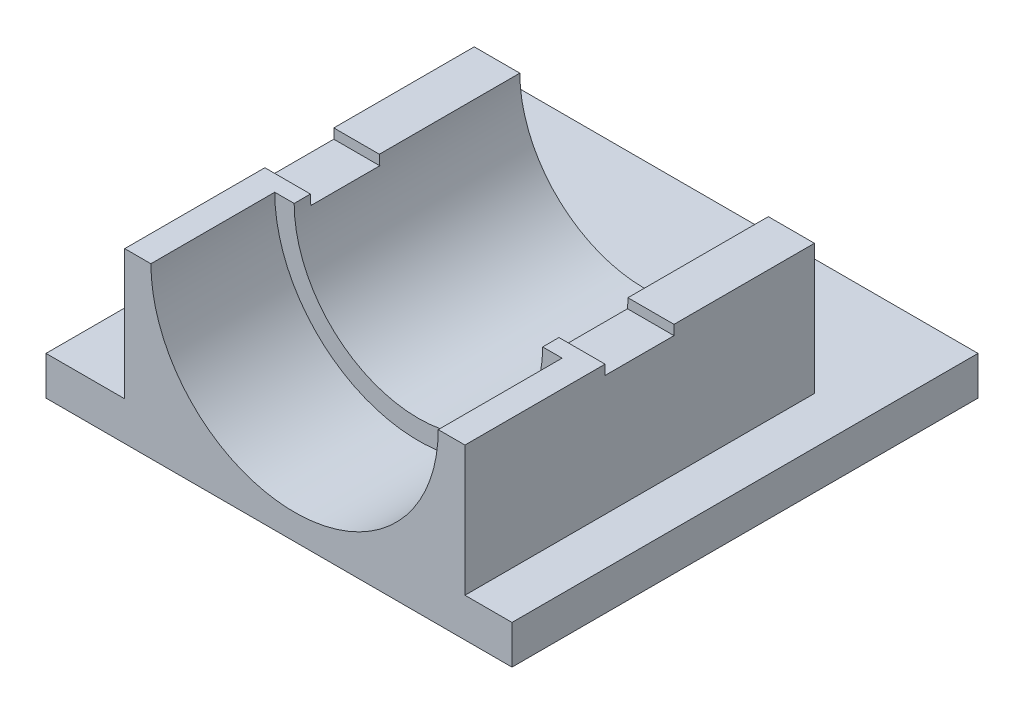
ISO-10303-21;
HEADER;
FILE_DESCRIPTION(('STEP AP214'),'2;1');
FILE_NAME('part.step','',(''),(''),'','','');
FILE_SCHEMA(('AUTOMOTIVE_DESIGN { 1 0 10303 214 1 1 1 1 }'));
ENDSEC;
DATA;
#1=APPLICATION_CONTEXT('core data for automotive mechanical design processes');
#2=APPLICATION_PROTOCOL_DEFINITION('international standard','automotive_design',2000,#1);
#3=PRODUCT_CONTEXT('',#1,'mechanical');
#4=PRODUCT('Part','Part','',(#3));
#5=PRODUCT_RELATED_PRODUCT_CATEGORY('part','',(#4));
#6=PRODUCT_DEFINITION_FORMATION('','',#4);
#7=PRODUCT_DEFINITION_CONTEXT('part definition',#1,'design');
#8=PRODUCT_DEFINITION('design','',#6,#7);
#9=PRODUCT_DEFINITION_SHAPE('','',#8);
#10=(LENGTH_UNIT() NAMED_UNIT(*) SI_UNIT(.MILLI.,.METRE.));
#11=(NAMED_UNIT(*) PLANE_ANGLE_UNIT() SI_UNIT($,.RADIAN.));
#12=(NAMED_UNIT(*) SI_UNIT($,.STERADIAN.) SOLID_ANGLE_UNIT());
#13=UNCERTAINTY_MEASURE_WITH_UNIT(LENGTH_MEASURE(1.E-05),#10,'distance_accuracy_value','');
#14=(GEOMETRIC_REPRESENTATION_CONTEXT(3) GLOBAL_UNCERTAINTY_ASSIGNED_CONTEXT((#13)) GLOBAL_UNIT_ASSIGNED_CONTEXT((#10,
#11,#12)) REPRESENTATION_CONTEXT('',''));
#15=CARTESIAN_POINT('',(0.,0.,0.));
#16=DIRECTION('',(0.,0.,1.));
#17=DIRECTION('',(1.,0.,0.));
#18=AXIS2_PLACEMENT_3D('',#15,#16,#17);
#19=CARTESIAN_POINT('',(-34.2277855679569,21.75,-40.4854368932039));
#20=DIRECTION('',(0.,-1.,0.));
#21=DIRECTION('',(0.,0.,-1.));
#22=AXIS2_PLACEMENT_3D('',#19,#20,#21);
#23=PLANE('',#22);
#24=DIRECTION('',(0.,0.,1.));
#25=VECTOR('',#24,1.);
#26=CARTESIAN_POINT('',(21.9027936314404,21.75,0.));
#27=LINE('',#26,#25);
#28=CARTESIAN_POINT('',(21.9027936314404,21.75,1.47192518337784));
#29=VERTEX_POINT('',#28);
#30=CARTESIAN_POINT('',(21.9027936314404,21.75,19.5145631067961));
#31=VERTEX_POINT('',#30);
#32=EDGE_CURVE('E276',#29,#31,#27,.T.);
#33=ORIENTED_EDGE('',*,*,#32,.F.);
#34=DIRECTION('',(1.,0.,0.));
#35=VECTOR('',#34,1.);
#36=CARTESIAN_POINT('',(-32.0388349514563,21.75,1.47192518337784));
#37=LINE('',#36,#35);
#38=CARTESIAN_POINT('',(15.9655162352662,21.75,1.47192518337784));
#39=VERTEX_POINT('',#38);
#40=EDGE_CURVE('E69',#39,#29,#37,.T.);
#41=ORIENTED_EDGE('',*,*,#40,.F.);
#42=DIRECTION('',(0.,0.,-1.));
#43=VECTOR('',#42,1.);
#44=CARTESIAN_POINT('',(15.9655162352662,21.75,3.56748567590681));
#45=LINE('',#44,#43);
#46=CARTESIAN_POINT('',(15.9655162352662,21.75,3.56748567590681));
#47=VERTEX_POINT('',#46);
#48=EDGE_CURVE('E238',#39,#47,#45,.F.);
#49=ORIENTED_EDGE('',*,*,#48,.T.);
#50=DIRECTION('',(1.,0.,0.));
#51=VECTOR('',#50,1.);
#52=CARTESIAN_POINT('',(-0.0344541676912807,21.75,3.56748567590681));
#53=LINE('',#52,#51);
#54=CARTESIAN_POINT('',(18.4655202348725,21.75,3.56748567590681));
#55=VERTEX_POINT('',#54);
#56=EDGE_CURVE('E235',#47,#55,#53,.T.);
#57=ORIENTED_EDGE('',*,*,#56,.T.);
#58=DIRECTION('',(0.,0.,-1.));
#59=VECTOR('',#58,1.);
#60=CARTESIAN_POINT('',(18.4655202348725,21.75,28.5674856759068));
#61=LINE('',#60,#59);
#62=CARTESIAN_POINT('',(18.4655202348725,21.75,19.5145631067961));
#63=VERTEX_POINT('',#62);
#64=EDGE_CURVE('E237',#55,#63,#61,.F.);
#65=ORIENTED_EDGE('',*,*,#64,.T.);
#66=DIRECTION('',(1.,0.,0.));
#67=VECTOR('',#66,1.);
#68=CARTESIAN_POINT('',(-34.2277855679569,21.75,19.5145631067961));
#69=LINE('',#68,#67);
#70=EDGE_CURVE('E281',#63,#31,#69,.T.);
#71=ORIENTED_EDGE('',*,*,#70,.T.);
#72=EDGE_LOOP('',(#33,#41,#49,#57,#65,#71));
#73=FACE_BOUND('',#72,.T.);
#74=ADVANCED_FACE('F38',(#73),#23,.F.);
#75=DIRECTION('',(0.,0.,-1.));
#76=VECTOR('',#75,1.);
#77=CARTESIAN_POINT('',(-16.0344245706488,21.75,3.56748567590681));
#78=LINE('',#77,#76);
#79=CARTESIAN_POINT('',(-16.0344245706488,21.75,3.56748567590681));
#80=VERTEX_POINT('',#79);
#81=CARTESIAN_POINT('',(-16.0344245706488,21.75,1.47192518337784));
#82=VERTEX_POINT('',#81);
#83=EDGE_CURVE('E42',#80,#82,#78,.T.);
#84=ORIENTED_EDGE('',*,*,#83,.T.);
#85=DIRECTION('',(-1.,0.,0.));
#86=VECTOR('',#85,1.);
#87=CARTESIAN_POINT('',(-34.2277855679569,21.75,1.47192518337785));
#88=LINE('',#87,#86);
#89=CARTESIAN_POINT('',(-21.9027936314475,21.75,1.47192518337784));
#90=VERTEX_POINT('',#89);
#91=EDGE_CURVE('E189',#82,#90,#88,.T.);
#92=ORIENTED_EDGE('',*,*,#91,.T.);
#93=DIRECTION('',(0.,0.,1.));
#94=VECTOR('',#93,1.);
#95=CARTESIAN_POINT('',(-21.9027936314404,21.75,0.));
#96=LINE('',#95,#94);
#97=CARTESIAN_POINT('',(-21.9027936314404,21.75,19.5145631067961));
#98=VERTEX_POINT('',#97);
#99=EDGE_CURVE('E210',#90,#98,#96,.T.);
#100=ORIENTED_EDGE('',*,*,#99,.T.);
#101=CARTESIAN_POINT('',(-18.5344285702551,21.75,19.5145631067961));
#102=VERTEX_POINT('',#101);
#103=EDGE_CURVE('E272',#98,#102,#69,.T.);
#104=ORIENTED_EDGE('',*,*,#103,.T.);
#105=DIRECTION('',(0.,0.,-1.));
#106=VECTOR('',#105,1.);
#107=CARTESIAN_POINT('',(-18.5344285702551,21.75,28.5674856759068));
#108=LINE('',#107,#106);
#109=CARTESIAN_POINT('',(-18.5344285702551,21.75,3.56748567590681));
#110=VERTEX_POINT('',#109);
#111=EDGE_CURVE('E270',#102,#110,#108,.T.);
#112=ORIENTED_EDGE('',*,*,#111,.T.);
#113=EDGE_CURVE('E218',#110,#80,#53,.T.);
#114=ORIENTED_EDGE('',*,*,#113,.T.);
#115=EDGE_LOOP('',(#84,#92,#100,#104,#112,#114));
#116=FACE_BOUND('',#115,.T.);
#117=ADVANCED_FACE('F393',(#116),#23,.F.);
#118=CARTESIAN_POINT('',(-32.0388349514563,5.,19.5145631067961));
#119=DIRECTION('',(1.,0.,0.));
#120=DIRECTION('',(0.,0.,-1.));
#121=AXIS2_PLACEMENT_3D('',#118,#119,#120);
#122=PLANE('',#121);
#123=DIRECTION('',(0.,-1.,0.));
#124=VECTOR('',#123,1.);
#125=CARTESIAN_POINT('',(-32.0388349514563,5.,-40.4854368932039));
#126=LINE('',#125,#124);
#127=CARTESIAN_POINT('',(-32.0388349514563,5.,-40.4854368932039));
#128=VERTEX_POINT('',#127);
#129=CARTESIAN_POINT('',(-32.0388349514563,0.0100000000000005,-40.4854368932039));
#130=VERTEX_POINT('',#129);
#131=EDGE_CURVE('E214',#128,#130,#126,.T.);
#132=ORIENTED_EDGE('',*,*,#131,.T.);
#133=DIRECTION('',(0.,0.,1.));
#134=VECTOR('',#133,1.);
#135=CARTESIAN_POINT('',(-32.0388349514563,0.01,-44.9701373124576));
#136=LINE('',#135,#134);
#137=CARTESIAN_POINT('',(-32.0388349514563,0.01,19.5145631067961));
#138=VERTEX_POINT('',#137);
#139=EDGE_CURVE('E217',#130,#138,#136,.T.);
#140=ORIENTED_EDGE('',*,*,#139,.T.);
#141=DIRECTION('',(0.,-1.,0.));
#142=VECTOR('',#141,1.);
#143=CARTESIAN_POINT('',(-32.0388349514563,5.,19.5145631067961));
#144=LINE('',#143,#142);
#145=CARTESIAN_POINT('',(-32.0388349514563,5.,19.5145631067961));
#146=VERTEX_POINT('',#145);
#147=EDGE_CURVE('E219',#146,#138,#144,.T.);
#148=ORIENTED_EDGE('',*,*,#147,.F.);
#149=DIRECTION('',(0.,0.,1.));
#150=VECTOR('',#149,1.);
#151=CARTESIAN_POINT('',(-32.0388349514563,5.,19.5145631067961));
#152=LINE('',#151,#150);
#153=EDGE_CURVE('E244',#128,#146,#152,.T.);
#154=ORIENTED_EDGE('',*,*,#153,.F.);
#155=EDGE_LOOP('',(#132,#140,#148,#154));
#156=FACE_BOUND('',#155,.T.);
#157=ADVANCED_FACE('F373',(#156),#122,.F.);
#158=CARTESIAN_POINT('',(-32.0388349514563,5.,19.5145631067961));
#159=DIRECTION('',(0.,0.,-1.));
#160=DIRECTION('',(-1.,0.,0.));
#161=AXIS2_PLACEMENT_3D('',#158,#159,#160);
#162=PLANE('',#161);
#163=ORIENTED_EDGE('',*,*,#147,.T.);
#164=DIRECTION('',(1.,0.,0.));
#165=VECTOR('',#164,1.);
#166=CARTESIAN_POINT('',(-32.0388349514563,0.00999999999999959,19.5145631067961));
#167=LINE('',#166,#165);
#168=CARTESIAN_POINT('',(27.9611650485437,0.00999999999999959,19.5145631067961));
#169=VERTEX_POINT('',#168);
#170=EDGE_CURVE('E222',#138,#169,#167,.T.);
#171=ORIENTED_EDGE('',*,*,#170,.T.);
#172=DIRECTION('',(0.,-1.,0.));
#173=VECTOR('',#172,1.);
#174=CARTESIAN_POINT('',(27.9611650485437,5.,19.5145631067961));
#175=LINE('',#174,#173);
#176=CARTESIAN_POINT('',(27.9611650485437,5.,19.5145631067961));
#177=VERTEX_POINT('',#176);
#178=EDGE_CURVE('E223',#177,#169,#175,.T.);
#179=ORIENTED_EDGE('',*,*,#178,.F.);
#180=DIRECTION('',(1.,0.,0.));
#181=VECTOR('',#180,1.);
#182=CARTESIAN_POINT('',(-32.0388349514563,5.,19.5145631067961));
#183=LINE('',#182,#181);
#184=CARTESIAN_POINT('',(21.9027936314404,5.,19.5145631067961));
#185=VERTEX_POINT('',#184);
#186=EDGE_CURVE('E247',#185,#177,#183,.T.);
#187=ORIENTED_EDGE('',*,*,#186,.F.);
#188=DIRECTION('',(0.,-1.,0.));
#189=VECTOR('',#188,1.);
#190=CARTESIAN_POINT('',(21.9027936314404,25.,19.5145631067961));
#191=LINE('',#190,#189);
#192=EDGE_CURVE('E264',#31,#185,#191,.T.);
#193=ORIENTED_EDGE('',*,*,#192,.F.);
#194=ORIENTED_EDGE('',*,*,#70,.F.);
#195=CARTESIAN_POINT('',(-0.0344541676912807,21.7807750626998,19.5145631067961));
#196=DIRECTION('',(0.,0.,-1.));
#197=DIRECTION('',(-1.,0.,0.));
#198=AXIS2_PLACEMENT_3D('',#195,#196,#197);
#199=CIRCLE('',#198,18.5);
#200=EDGE_CURVE('E258',#102,#63,#199,.F.);
#201=ORIENTED_EDGE('',*,*,#200,.F.);
#202=ORIENTED_EDGE('',*,*,#103,.F.);
#203=DIRECTION('',(0.,-1.,0.));
#204=VECTOR('',#203,1.);
#205=CARTESIAN_POINT('',(-21.9027936314404,25.,19.5145631067961));
#206=LINE('',#205,#204);
#207=CARTESIAN_POINT('',(-21.9027936314404,5.,19.5145631067961));
#208=VERTEX_POINT('',#207);
#209=EDGE_CURVE('E227',#98,#208,#206,.T.);
#210=ORIENTED_EDGE('',*,*,#209,.T.);
#211=EDGE_CURVE('E248',#146,#208,#183,.T.);
#212=ORIENTED_EDGE('',*,*,#211,.F.);
#213=EDGE_LOOP('',(#163,#171,#179,#187,#193,#194,#201,#202,#210,#212));
#214=FACE_BOUND('',#213,.T.);
#215=ADVANCED_FACE('F360',(#214),#162,.F.);
#216=CARTESIAN_POINT('',(27.9611650485437,5.,19.5145631067961));
#217=DIRECTION('',(-1.,0.,0.));
#218=DIRECTION('',(0.,0.,1.));
#219=AXIS2_PLACEMENT_3D('',#216,#217,#218);
#220=PLANE('',#219);
#221=ORIENTED_EDGE('',*,*,#178,.T.);
#222=DIRECTION('',(0.,0.,-1.));
#223=VECTOR('',#222,1.);
#224=CARTESIAN_POINT('',(27.9611650485437,0.00999999999999959,19.5145631067961));
#225=LINE('',#224,#223);
#226=CARTESIAN_POINT('',(27.9611650485437,0.00999999999999959,-40.4854368932039));
#227=VERTEX_POINT('',#226);
#228=EDGE_CURVE('E226',#169,#227,#225,.T.);
#229=ORIENTED_EDGE('',*,*,#228,.T.);
#230=DIRECTION('',(0.,-1.,0.));
#231=VECTOR('',#230,1.);
#232=CARTESIAN_POINT('',(27.9611650485437,5.,-40.4854368932039));
#233=LINE('',#232,#231);
#234=CARTESIAN_POINT('',(27.9611650485437,5.,-40.4854368932039));
#235=VERTEX_POINT('',#234);
#236=EDGE_CURVE('E232',#235,#227,#233,.T.);
#237=ORIENTED_EDGE('',*,*,#236,.F.);
#238=DIRECTION('',(0.,0.,-1.));
#239=VECTOR('',#238,1.);
#240=CARTESIAN_POINT('',(27.9611650485437,5.,19.5145631067961));
#241=LINE('',#240,#239);
#242=EDGE_CURVE('E245',#177,#235,#241,.T.);
#243=ORIENTED_EDGE('',*,*,#242,.F.);
#244=EDGE_LOOP('',(#221,#229,#237,#243));
#245=FACE_BOUND('',#244,.T.);
#246=ADVANCED_FACE('F365',(#245),#220,.F.);
#247=CARTESIAN_POINT('',(-32.0388349514563,5.,-40.4854368932039));
#248=DIRECTION('',(0.,0.,1.));
#249=DIRECTION('',(1.,0.,0.));
#250=AXIS2_PLACEMENT_3D('',#247,#248,#249);
#251=PLANE('',#250);
#252=ORIENTED_EDGE('',*,*,#236,.T.);
#253=DIRECTION('',(-1.,0.,0.));
#254=VECTOR('',#253,1.);
#255=CARTESIAN_POINT('',(-32.0388349514563,0.00999999999999959,-40.4854368932039));
#256=LINE('',#255,#254);
#257=EDGE_CURVE('E241',#227,#130,#256,.T.);
#258=ORIENTED_EDGE('',*,*,#257,.T.);
#259=ORIENTED_EDGE('',*,*,#131,.F.);
#260=DIRECTION('',(-1.,0.,0.));
#261=VECTOR('',#260,1.);
#262=CARTESIAN_POINT('',(-32.0388349514563,5.,-40.4854368932039));
#263=LINE('',#262,#261);
#264=EDGE_CURVE('E242',#235,#128,#263,.T.);
#265=ORIENTED_EDGE('',*,*,#264,.F.);
#266=EDGE_LOOP('',(#252,#258,#259,#265));
#267=FACE_BOUND('',#266,.T.);
#268=ADVANCED_FACE('F371',(#267),#251,.F.);
#269=CARTESIAN_POINT('',(0.,5.,0.));
#270=DIRECTION('',(0.,-1.,0.));
#271=DIRECTION('',(0.,0.,-1.));
#272=AXIS2_PLACEMENT_3D('',#269,#270,#271);
#273=PLANE('',#272);
#274=ORIENTED_EDGE('',*,*,#211,.T.);
#275=DIRECTION('',(0.,0.,-1.));
#276=VECTOR('',#275,1.);
#277=CARTESIAN_POINT('',(-21.9027936314404,5.,0.));
#278=LINE('',#277,#276);
#279=CARTESIAN_POINT('',(-21.9027936314404,5.,-25.4854368932039));
#280=VERTEX_POINT('',#279);
#281=EDGE_CURVE('E251',#208,#280,#278,.T.);
#282=ORIENTED_EDGE('',*,*,#281,.T.);
#283=DIRECTION('',(-1.,0.,0.));
#284=VECTOR('',#283,1.);
#285=CARTESIAN_POINT('',(0.,5.,-25.4854368932039));
#286=LINE('',#285,#284);
#287=CARTESIAN_POINT('',(21.9027936314404,5.,-25.4854368932039));
#288=VERTEX_POINT('',#287);
#289=EDGE_CURVE('E255',#288,#280,#286,.T.);
#290=ORIENTED_EDGE('',*,*,#289,.F.);
#291=DIRECTION('',(0.,0.,-1.));
#292=VECTOR('',#291,1.);
#293=CARTESIAN_POINT('',(21.9027936314404,5.,0.));
#294=LINE('',#293,#292);
#295=EDGE_CURVE('E260',#185,#288,#294,.T.);
#296=ORIENTED_EDGE('',*,*,#295,.F.);
#297=ORIENTED_EDGE('',*,*,#186,.T.);
#298=ORIENTED_EDGE('',*,*,#242,.T.);
#299=ORIENTED_EDGE('',*,*,#264,.T.);
#300=ORIENTED_EDGE('',*,*,#153,.T.);
#301=EDGE_LOOP('',(#274,#282,#290,#296,#297,#298,#299,#300));
#302=FACE_BOUND('',#301,.T.);
#303=ADVANCED_FACE('F357',(#302),#273,.F.);
#304=CARTESIAN_POINT('',(-21.9027936314404,25.,0.));
#305=DIRECTION('',(-1.,0.,0.));
#306=DIRECTION('',(0.,0.,1.));
#307=AXIS2_PLACEMENT_3D('',#304,#305,#306);
#308=PLANE('',#307);
#309=DIRECTION('',(0.,1.,0.));
#310=VECTOR('',#309,1.);
#311=CARTESIAN_POINT('',(-21.9027936314404,25.,1.47192518337784));
#312=LINE('',#311,#310);
#313=CARTESIAN_POINT('',(-21.9027936314404,20.49,1.47192518337784));
#314=VERTEX_POINT('',#313);
#315=EDGE_CURVE('E195',#314,#90,#312,.T.);
#316=ORIENTED_EDGE('',*,*,#315,.F.);
#317=DIRECTION('',(0.,0.,1.));
#318=VECTOR('',#317,1.);
#319=CARTESIAN_POINT('',(-21.9027936314404,20.49,0.));
#320=LINE('',#319,#318);
#321=CARTESIAN_POINT('',(-21.9027936314404,20.49,-7.40382756529494));
#322=VERTEX_POINT('',#321);
#323=EDGE_CURVE('E202',#322,#314,#320,.T.);
#324=ORIENTED_EDGE('',*,*,#323,.F.);
#325=DIRECTION('',(0.,-1.,0.));
#326=VECTOR('',#325,1.);
#327=CARTESIAN_POINT('',(-21.9027936314404,25.,-7.40382756529494));
#328=LINE('',#327,#326);
#329=CARTESIAN_POINT('',(-21.9027936314404,21.75,-7.40382756529494));
#330=VERTEX_POINT('',#329);
#331=EDGE_CURVE('E194',#330,#322,#328,.T.);
#332=ORIENTED_EDGE('',*,*,#331,.F.);
#333=CARTESIAN_POINT('',(-21.9027936314404,21.75,-25.4854368932039));
#334=VERTEX_POINT('',#333);
#335=EDGE_CURVE('E213',#334,#330,#96,.T.);
#336=ORIENTED_EDGE('',*,*,#335,.F.);
#337=DIRECTION('',(0.,-1.,0.));
#338=VECTOR('',#337,1.);
#339=CARTESIAN_POINT('',(-21.9027936314404,25.,-25.4854368932039));
#340=LINE('',#339,#338);
#341=EDGE_CURVE('E254',#334,#280,#340,.T.);
#342=ORIENTED_EDGE('',*,*,#341,.T.);
#343=ORIENTED_EDGE('',*,*,#281,.F.);
#344=ORIENTED_EDGE('',*,*,#209,.F.);
#345=ORIENTED_EDGE('',*,*,#99,.F.);
#346=EDGE_LOOP('',(#316,#324,#332,#336,#342,#343,#344,#345));
#347=FACE_BOUND('',#346,.T.);
#348=ADVANCED_FACE('F378',(#347),#308,.T.);
#349=CARTESIAN_POINT('',(21.9027936314404,25.,0.));
#350=DIRECTION('',(-1.,0.,0.));
#351=DIRECTION('',(0.,0.,1.));
#352=AXIS2_PLACEMENT_3D('',#349,#350,#351);
#353=PLANE('',#352);
#354=DIRECTION('',(0.,0.,-1.));
#355=VECTOR('',#354,1.);
#356=CARTESIAN_POINT('',(21.9027936314404,20.49,0.));
#357=LINE('',#356,#355);
#358=CARTESIAN_POINT('',(21.9027936314404,20.49,1.47192518337784));
#359=VERTEX_POINT('',#358);
#360=CARTESIAN_POINT('',(21.9027936314404,20.49,-7.40382756529494));
#361=VERTEX_POINT('',#360);
#362=EDGE_CURVE('E11',#359,#361,#357,.T.);
#363=ORIENTED_EDGE('',*,*,#362,.F.);
#364=DIRECTION('',(0.,-1.,0.));
#365=VECTOR('',#364,1.);
#366=CARTESIAN_POINT('',(21.9027936314404,0.,1.47192518337784));
#367=LINE('',#366,#365);
#368=EDGE_CURVE('E314',#29,#359,#367,.T.);
#369=ORIENTED_EDGE('',*,*,#368,.F.);
#370=ORIENTED_EDGE('',*,*,#32,.T.);
#371=ORIENTED_EDGE('',*,*,#192,.T.);
#372=ORIENTED_EDGE('',*,*,#295,.T.);
#373=DIRECTION('',(0.,-1.,0.));
#374=VECTOR('',#373,1.);
#375=CARTESIAN_POINT('',(21.9027936314404,25.,-25.4854368932039));
#376=LINE('',#375,#374);
#377=CARTESIAN_POINT('',(21.9027936314404,21.75,-25.4854368932039));
#378=VERTEX_POINT('',#377);
#379=EDGE_CURVE('E259',#378,#288,#376,.T.);
#380=ORIENTED_EDGE('',*,*,#379,.F.);
#381=CARTESIAN_POINT('',(21.9027936314404,21.75,-7.40382756529494));
#382=VERTEX_POINT('',#381);
#383=EDGE_CURVE('E263',#378,#382,#27,.T.);
#384=ORIENTED_EDGE('',*,*,#383,.T.);
#385=DIRECTION('',(0.,1.,0.));
#386=VECTOR('',#385,1.);
#387=CARTESIAN_POINT('',(21.9027936314404,0.,-7.40382756529494));
#388=LINE('',#387,#386);
#389=EDGE_CURVE('E311',#361,#382,#388,.T.);
#390=ORIENTED_EDGE('',*,*,#389,.F.);
#391=EDGE_LOOP('',(#363,#369,#370,#371,#372,#380,#384,#390));
#392=FACE_BOUND('',#391,.T.);
#393=ADVANCED_FACE('F349',(#392),#353,.F.);
#394=CARTESIAN_POINT('',(0.,25.,-25.4854368932039));
#395=DIRECTION('',(0.,0.,1.));
#396=DIRECTION('',(1.,0.,0.));
#397=AXIS2_PLACEMENT_3D('',#394,#395,#396);
#398=PLANE('',#397);
#399=ORIENTED_EDGE('',*,*,#341,.F.);
#400=DIRECTION('',(1.,0.,0.));
#401=VECTOR('',#400,1.);
#402=CARTESIAN_POINT('',(0.,21.75,-25.4854368932039));
#403=LINE('',#402,#401);
#404=CARTESIAN_POINT('',(-16.0344245706488,21.75,-25.4854368932039));
#405=VERTEX_POINT('',#404);
#406=EDGE_CURVE('E275',#334,#405,#403,.T.);
#407=ORIENTED_EDGE('',*,*,#406,.T.);
#408=CARTESIAN_POINT('',(-0.0344541676912807,21.7807750626998,-25.4854368932039));
#409=DIRECTION('',(0.,0.,1.));
#410=DIRECTION('',(1.,0.,0.));
#411=AXIS2_PLACEMENT_3D('',#408,#409,#410);
#412=CIRCLE('',#411,16.);
#413=CARTESIAN_POINT('',(15.9655162352662,21.75,-25.4854368932039));
#414=VERTEX_POINT('',#413);
#415=EDGE_CURVE('E290',#414,#405,#412,.F.);
#416=ORIENTED_EDGE('',*,*,#415,.F.);
#417=EDGE_CURVE('E277',#414,#378,#403,.T.);
#418=ORIENTED_EDGE('',*,*,#417,.T.);
#419=ORIENTED_EDGE('',*,*,#379,.T.);
#420=ORIENTED_EDGE('',*,*,#289,.T.);
#421=EDGE_LOOP('',(#399,#407,#416,#418,#419,#420));
#422=FACE_BOUND('',#421,.T.);
#423=ADVANCED_FACE('F339',(#422),#398,.F.);
#424=CARTESIAN_POINT('',(-0.0344541676912807,21.7807750626998,28.5674856759068));
#425=DIRECTION('',(0.,0.,-1.));
#426=DIRECTION('',(-1.,0.,0.));
#427=AXIS2_PLACEMENT_3D('',#424,#425,#426);
#428=CYLINDRICAL_SURFACE('',#427,18.5);
#429=ORIENTED_EDGE('',*,*,#111,.F.);
#430=ORIENTED_EDGE('',*,*,#200,.T.);
#431=ORIENTED_EDGE('',*,*,#64,.F.);
#432=CARTESIAN_POINT('',(-0.0344541676912807,21.7807750626998,3.56748567590681));
#433=DIRECTION('',(0.,0.,1.));
#434=DIRECTION('',(1.,0.,0.));
#435=AXIS2_PLACEMENT_3D('',#432,#433,#434);
#436=CIRCLE('',#435,18.5);
#437=EDGE_CURVE('E296',#110,#55,#436,.T.);
#438=ORIENTED_EDGE('',*,*,#437,.F.);
#439=EDGE_LOOP('',(#429,#430,#431,#438));
#440=FACE_BOUND('',#439,.T.);
#441=ADVANCED_FACE('F409',(#440),#428,.F.);
#442=CARTESIAN_POINT('',(-0.0344541676912807,21.7807750626998,3.56748567590681));
#443=DIRECTION('',(0.,0.,-1.));
#444=DIRECTION('',(-1.,0.,0.));
#445=AXIS2_PLACEMENT_3D('',#442,#443,#444);
#446=CYLINDRICAL_SURFACE('',#445,16.);
#447=CARTESIAN_POINT('',(-0.0344541676912807,21.7807750626998,1.47192518337784));
#448=DIRECTION('',(0.,0.,1.));
#449=DIRECTION('',(1.,0.,0.));
#450=AXIS2_PLACEMENT_3D('',#447,#448,#449);
#451=CIRCLE('',#450,16.);
#452=CARTESIAN_POINT('',(15.9133952088708,20.49,1.47192518337784));
#453=VERTEX_POINT('',#452);
#454=EDGE_CURVE('E76',#453,#39,#451,.T.);
#455=ORIENTED_EDGE('',*,*,#454,.F.);
#456=DIRECTION('',(0.,0.,-1.));
#457=VECTOR('',#456,1.);
#458=CARTESIAN_POINT('',(15.9133952088708,20.49,3.56748567590681));
#459=LINE('',#458,#457);
#460=CARTESIAN_POINT('',(15.9133952088708,20.49,-7.40382756529494));
#461=VERTEX_POINT('',#460);
#462=EDGE_CURVE('E208',#461,#453,#459,.F.);
#463=ORIENTED_EDGE('',*,*,#462,.F.);
#464=CARTESIAN_POINT('',(-0.0344541676912807,21.7807750626998,-7.40382756529494));
#465=DIRECTION('',(0.,0.,-1.));
#466=DIRECTION('',(-1.,0.,0.));
#467=AXIS2_PLACEMENT_3D('',#464,#465,#466);
#468=CIRCLE('',#467,16.);
#469=CARTESIAN_POINT('',(15.9655162352662,21.75,-7.40382756529494));
#470=VERTEX_POINT('',#469);
#471=EDGE_CURVE('E307',#470,#461,#468,.T.);
#472=ORIENTED_EDGE('',*,*,#471,.F.);
#473=EDGE_CURVE('E299',#414,#470,#45,.F.);
#474=ORIENTED_EDGE('',*,*,#473,.F.);
#475=ORIENTED_EDGE('',*,*,#415,.T.);
#476=CARTESIAN_POINT('',(-16.0344245706488,21.75,-7.40382756529494));
#477=VERTEX_POINT('',#476);
#478=EDGE_CURVE('E212',#477,#405,#78,.T.);
#479=ORIENTED_EDGE('',*,*,#478,.F.);
#480=CARTESIAN_POINT('',(-15.9823035442534,20.49,-7.40382756529494));
#481=VERTEX_POINT('',#480);
#482=EDGE_CURVE('E106',#481,#477,#468,.T.);
#483=ORIENTED_EDGE('',*,*,#482,.F.);
#484=DIRECTION('',(0.,0.,-1.));
#485=VECTOR('',#484,1.);
#486=CARTESIAN_POINT('',(-15.9823035442534,20.49,3.56748567590681));
#487=LINE('',#486,#485);
#488=CARTESIAN_POINT('',(-15.9823035442534,20.49,1.47192518337784));
#489=VERTEX_POINT('',#488);
#490=EDGE_CURVE('E200',#489,#481,#487,.T.);
#491=ORIENTED_EDGE('',*,*,#490,.F.);
#492=EDGE_CURVE('E183',#82,#489,#451,.T.);
#493=ORIENTED_EDGE('',*,*,#492,.F.);
#494=ORIENTED_EDGE('',*,*,#83,.F.);
#495=CARTESIAN_POINT('',(-0.0344541676912807,21.7807750626998,3.56748567590681));
#496=DIRECTION('',(0.,0.,1.));
#497=DIRECTION('',(1.,0.,0.));
#498=AXIS2_PLACEMENT_3D('',#495,#496,#497);
#499=CIRCLE('',#498,16.);
#500=EDGE_CURVE('E293',#80,#47,#499,.T.);
#501=ORIENTED_EDGE('',*,*,#500,.T.);
#502=ORIENTED_EDGE('',*,*,#48,.F.);
#503=EDGE_LOOP('',(#455,#463,#472,#474,#475,#479,#483,#491,#493,#494,#501,#502));
#504=FACE_BOUND('',#503,.T.);
#505=ADVANCED_FACE('F40',(#504),#446,.F.);
#506=CARTESIAN_POINT('',(-0.0344541676912807,21.7807750626998,3.56748567590681));
#507=DIRECTION('',(0.,0.,1.));
#508=DIRECTION('',(1.,0.,0.));
#509=AXIS2_PLACEMENT_3D('',#506,#507,#508);
#510=PLANE('',#509);
#511=ORIENTED_EDGE('',*,*,#113,.F.);
#512=ORIENTED_EDGE('',*,*,#437,.T.);
#513=ORIENTED_EDGE('',*,*,#56,.F.);
#514=ORIENTED_EDGE('',*,*,#500,.F.);
#515=EDGE_LOOP('',(#511,#512,#513,#514));
#516=FACE_BOUND('',#515,.T.);
#517=ADVANCED_FACE('F329',(#516),#510,.T.);
#518=ORIENTED_EDGE('',*,*,#473,.T.);
#519=DIRECTION('',(1.,0.,0.));
#520=VECTOR('',#519,1.);
#521=CARTESIAN_POINT('',(-32.0388349514563,21.75,-7.40382756529494));
#522=LINE('',#521,#520);
#523=EDGE_CURVE('E269',#470,#382,#522,.T.);
#524=ORIENTED_EDGE('',*,*,#523,.T.);
#525=ORIENTED_EDGE('',*,*,#383,.F.);
#526=ORIENTED_EDGE('',*,*,#417,.F.);
#527=EDGE_LOOP('',(#518,#524,#525,#526));
#528=FACE_BOUND('',#527,.T.);
#529=ADVANCED_FACE('F351',(#528),#23,.F.);
#530=ORIENTED_EDGE('',*,*,#335,.T.);
#531=DIRECTION('',(1.,0.,0.));
#532=VECTOR('',#531,1.);
#533=CARTESIAN_POINT('',(-34.2277855679569,21.75,-7.40382756529494));
#534=LINE('',#533,#532);
#535=EDGE_CURVE('E100',#330,#477,#534,.T.);
#536=ORIENTED_EDGE('',*,*,#535,.T.);
#537=ORIENTED_EDGE('',*,*,#478,.T.);
#538=ORIENTED_EDGE('',*,*,#406,.F.);
#539=EDGE_LOOP('',(#530,#536,#537,#538));
#540=FACE_BOUND('',#539,.T.);
#541=ADVANCED_FACE('F334',(#540),#23,.F.);
#542=CARTESIAN_POINT('',(-32.0388349514563,0.01,-44.9701373124576));
#543=DIRECTION('',(0.,1.,0.));
#544=DIRECTION('',(0.,0.,1.));
#545=AXIS2_PLACEMENT_3D('',#542,#543,#544);
#546=PLANE('',#545);
#547=ORIENTED_EDGE('',*,*,#139,.F.);
#548=ORIENTED_EDGE('',*,*,#257,.F.);
#549=ORIENTED_EDGE('',*,*,#228,.F.);
#550=ORIENTED_EDGE('',*,*,#170,.F.);
#551=EDGE_LOOP('',(#547,#548,#549,#550));
#552=FACE_BOUND('',#551,.T.);
#553=ADVANCED_FACE('F389',(#552),#546,.F.);
#554=CARTESIAN_POINT('',(-32.0388349514563,0.,1.47192518337784));
#555=DIRECTION('',(0.,0.,1.));
#556=DIRECTION('',(1.,0.,0.));
#557=AXIS2_PLACEMENT_3D('',#554,#555,#556);
#558=PLANE('',#557);
#559=ORIENTED_EDGE('',*,*,#315,.T.);
#560=ORIENTED_EDGE('',*,*,#91,.F.);
#561=ORIENTED_EDGE('',*,*,#492,.T.);
#562=DIRECTION('',(1.,0.,0.));
#563=VECTOR('',#562,1.);
#564=CARTESIAN_POINT('',(-32.0388349514563,20.49,1.47192518337784));
#565=LINE('',#564,#563);
#566=EDGE_CURVE('E186',#314,#489,#565,.T.);
#567=ORIENTED_EDGE('',*,*,#566,.F.);
#568=EDGE_LOOP('',(#559,#560,#561,#567));
#569=FACE_BOUND('',#568,.T.);
#570=ADVANCED_FACE('F185',(#569),#558,.F.);
#571=CARTESIAN_POINT('',(-32.0388349514563,0.,-7.40382756529494));
#572=DIRECTION('',(0.,0.,-1.));
#573=DIRECTION('',(-1.,0.,0.));
#574=AXIS2_PLACEMENT_3D('',#571,#572,#573);
#575=PLANE('',#574);
#576=ORIENTED_EDGE('',*,*,#331,.T.);
#577=DIRECTION('',(1.,0.,0.));
#578=VECTOR('',#577,1.);
#579=CARTESIAN_POINT('',(-32.0388349514563,20.49,-7.40382756529494));
#580=LINE('',#579,#578);
#581=EDGE_CURVE('E305',#322,#481,#580,.T.);
#582=ORIENTED_EDGE('',*,*,#581,.T.);
#583=ORIENTED_EDGE('',*,*,#482,.T.);
#584=ORIENTED_EDGE('',*,*,#535,.F.);
#585=EDGE_LOOP('',(#576,#582,#583,#584));
#586=FACE_BOUND('',#585,.T.);
#587=ADVANCED_FACE('F380',(#586),#575,.F.);
#588=CARTESIAN_POINT('',(-32.0388349514563,20.49,0.));
#589=DIRECTION('',(0.,-1.,0.));
#590=DIRECTION('',(0.,0.,-1.));
#591=AXIS2_PLACEMENT_3D('',#588,#589,#590);
#592=PLANE('',#591);
#593=ORIENTED_EDGE('',*,*,#323,.T.);
#594=ORIENTED_EDGE('',*,*,#566,.T.);
#595=ORIENTED_EDGE('',*,*,#490,.T.);
#596=ORIENTED_EDGE('',*,*,#581,.F.);
#597=EDGE_LOOP('',(#593,#594,#595,#596));
#598=FACE_BOUND('',#597,.T.);
#599=ADVANCED_FACE('F198',(#598),#592,.F.);
#600=ORIENTED_EDGE('',*,*,#454,.T.);
#601=ORIENTED_EDGE('',*,*,#40,.T.);
#602=ORIENTED_EDGE('',*,*,#368,.T.);
#603=EDGE_CURVE('E48',#453,#359,#565,.T.);
#604=ORIENTED_EDGE('',*,*,#603,.F.);
#605=EDGE_LOOP('',(#600,#601,#602,#604));
#606=FACE_BOUND('',#605,.T.);
#607=ADVANCED_FACE('F387',(#606),#558,.F.);
#608=ORIENTED_EDGE('',*,*,#471,.T.);
#609=EDGE_CURVE('E308',#461,#361,#580,.T.);
#610=ORIENTED_EDGE('',*,*,#609,.T.);
#611=ORIENTED_EDGE('',*,*,#389,.T.);
#612=ORIENTED_EDGE('',*,*,#523,.F.);
#613=EDGE_LOOP('',(#608,#610,#611,#612));
#614=FACE_BOUND('',#613,.T.);
#615=ADVANCED_FACE('F344',(#614),#575,.F.);
#616=ORIENTED_EDGE('',*,*,#462,.T.);
#617=ORIENTED_EDGE('',*,*,#603,.T.);
#618=ORIENTED_EDGE('',*,*,#362,.T.);
#619=ORIENTED_EDGE('',*,*,#609,.F.);
#620=EDGE_LOOP('',(#616,#617,#618,#619));
#621=FACE_BOUND('',#620,.T.);
#622=ADVANCED_FACE('F345',(#621),#592,.F.);
#623=CLOSED_SHELL('',(#74,#117,#157,#215,#246,#268,#303,#348,#393,#423,#441,#505,#517,#529,#541,
#553,#570,#587,#599,#607,#615,#622));
#624=MANIFOLD_SOLID_BREP('B2',#623);
#625=ADVANCED_BREP_SHAPE_REPRESENTATION('',(#18,#624),#14);
#626=SHAPE_DEFINITION_REPRESENTATION(#9,#625);
ENDSEC;
END-ISO-10303-21;
